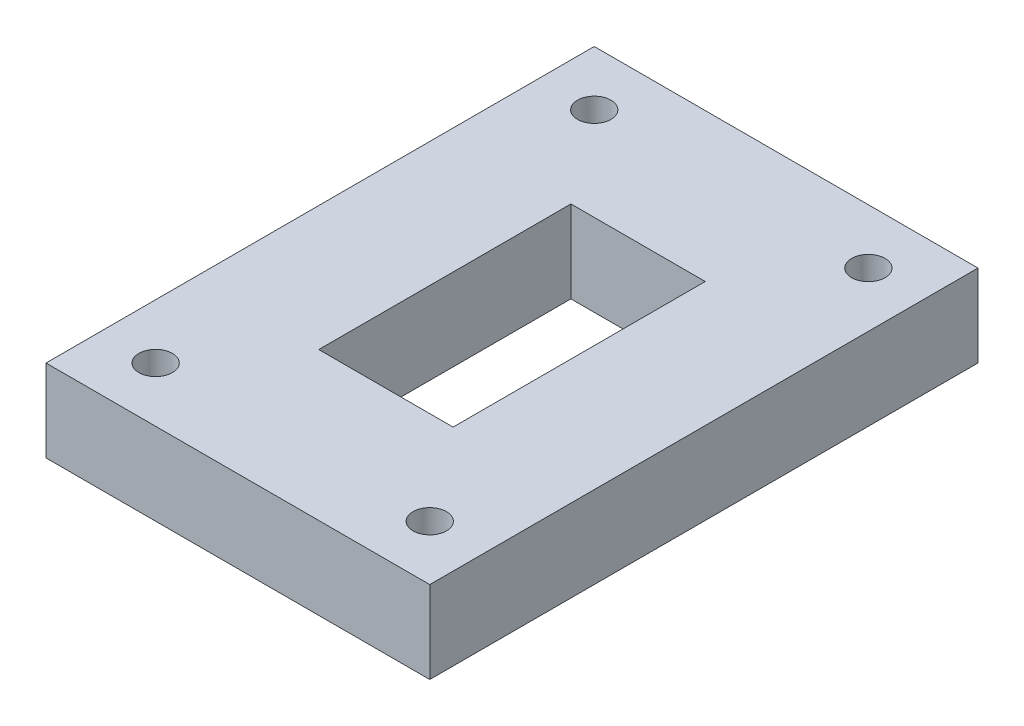
ISO-10303-21;
HEADER;
FILE_DESCRIPTION(('STEP AP214'),'2;1');
FILE_NAME('part.step','',(''),(''),'','','');
FILE_SCHEMA(('AUTOMOTIVE_DESIGN { 1 0 10303 214 1 1 1 1 }'));
ENDSEC;
DATA;
#1=APPLICATION_CONTEXT('core data for automotive mechanical design processes');
#2=APPLICATION_PROTOCOL_DEFINITION('international standard','automotive_design',2000,#1);
#3=PRODUCT_CONTEXT('',#1,'mechanical');
#4=PRODUCT('Part','Part','',(#3));
#5=PRODUCT_RELATED_PRODUCT_CATEGORY('part','',(#4));
#6=PRODUCT_DEFINITION_FORMATION('','',#4);
#7=PRODUCT_DEFINITION_CONTEXT('part definition',#1,'design');
#8=PRODUCT_DEFINITION('design','',#6,#7);
#9=PRODUCT_DEFINITION_SHAPE('','',#8);
#10=(LENGTH_UNIT() NAMED_UNIT(*) SI_UNIT(.MILLI.,.METRE.));
#11=(NAMED_UNIT(*) PLANE_ANGLE_UNIT() SI_UNIT($,.RADIAN.));
#12=(NAMED_UNIT(*) SI_UNIT($,.STERADIAN.) SOLID_ANGLE_UNIT());
#13=UNCERTAINTY_MEASURE_WITH_UNIT(LENGTH_MEASURE(1.E-05),#10,'distance_accuracy_value','');
#14=(GEOMETRIC_REPRESENTATION_CONTEXT(3) GLOBAL_UNCERTAINTY_ASSIGNED_CONTEXT((#13)) GLOBAL_UNIT_ASSIGNED_CONTEXT((#10,
#11,#12)) REPRESENTATION_CONTEXT('',''));
#15=CARTESIAN_POINT('',(0.,0.,0.));
#16=DIRECTION('',(0.,0.,1.));
#17=DIRECTION('',(1.,0.,0.));
#18=AXIS2_PLACEMENT_3D('',#15,#16,#17);
#19=CARTESIAN_POINT('',(0.,-7.5,0.));
#20=DIRECTION('',(-1.,0.,0.));
#21=DIRECTION('',(0.,0.,1.));
#22=AXIS2_PLACEMENT_3D('',#19,#20,#21);
#23=PLANE('',#22);
#24=DIRECTION('',(0.,0.,1.));
#25=VECTOR('',#24,1.);
#26=CARTESIAN_POINT('',(0.,0.,0.));
#27=LINE('',#26,#25);
#28=CARTESIAN_POINT('',(0.,0.,0.));
#29=VERTEX_POINT('',#28);
#30=CARTESIAN_POINT('',(0.,0.,50.));
#31=VERTEX_POINT('',#30);
#32=EDGE_CURVE('E137',#29,#31,#27,.T.);
#33=ORIENTED_EDGE('',*,*,#32,.F.);
#34=DIRECTION('',(0.,1.,0.));
#35=VECTOR('',#34,1.);
#36=CARTESIAN_POINT('',(0.,-7.5,0.));
#37=LINE('',#36,#35);
#38=CARTESIAN_POINT('',(0.,-7.5,0.));
#39=VERTEX_POINT('',#38);
#40=EDGE_CURVE('E11',#39,#29,#37,.T.);
#41=ORIENTED_EDGE('',*,*,#40,.F.);
#42=DIRECTION('',(0.,0.,1.));
#43=VECTOR('',#42,1.);
#44=CARTESIAN_POINT('',(0.,-7.5,0.));
#45=LINE('',#44,#43);
#46=CARTESIAN_POINT('',(0.,-7.5,50.));
#47=VERTEX_POINT('',#46);
#48=EDGE_CURVE('E141',#39,#47,#45,.T.);
#49=ORIENTED_EDGE('',*,*,#48,.T.);
#50=DIRECTION('',(0.,1.,0.));
#51=VECTOR('',#50,1.);
#52=CARTESIAN_POINT('',(0.,-7.5,50.));
#53=LINE('',#52,#51);
#54=EDGE_CURVE('E38',#47,#31,#53,.T.);
#55=ORIENTED_EDGE('',*,*,#54,.T.);
#56=EDGE_LOOP('',(#33,#41,#49,#55));
#57=FACE_BOUND('',#56,.T.);
#58=ADVANCED_FACE('F35',(#57),#23,.T.);
#59=CARTESIAN_POINT('',(0.,-7.5,0.));
#60=DIRECTION('',(0.,0.,-1.));
#61=DIRECTION('',(-1.,0.,0.));
#62=AXIS2_PLACEMENT_3D('',#59,#60,#61);
#63=PLANE('',#62);
#64=DIRECTION('',(-1.,0.,0.));
#65=VECTOR('',#64,1.);
#66=CARTESIAN_POINT('',(0.,0.,0.));
#67=LINE('',#66,#65);
#68=CARTESIAN_POINT('',(35.,0.,0.));
#69=VERTEX_POINT('',#68);
#70=EDGE_CURVE('E145',#69,#29,#67,.T.);
#71=ORIENTED_EDGE('',*,*,#70,.F.);
#72=DIRECTION('',(0.,1.,0.));
#73=VECTOR('',#72,1.);
#74=CARTESIAN_POINT('',(35.,-7.5,0.));
#75=LINE('',#74,#73);
#76=CARTESIAN_POINT('',(35.,-7.5,0.));
#77=VERTEX_POINT('',#76);
#78=EDGE_CURVE('E43',#77,#69,#75,.T.);
#79=ORIENTED_EDGE('',*,*,#78,.F.);
#80=DIRECTION('',(-1.,0.,0.));
#81=VECTOR('',#80,1.);
#82=CARTESIAN_POINT('',(0.,-7.5,0.));
#83=LINE('',#82,#81);
#84=EDGE_CURVE('E151',#77,#39,#83,.T.);
#85=ORIENTED_EDGE('',*,*,#84,.T.);
#86=ORIENTED_EDGE('',*,*,#40,.T.);
#87=EDGE_LOOP('',(#71,#79,#85,#86));
#88=FACE_BOUND('',#87,.T.);
#89=ADVANCED_FACE('F177',(#88),#63,.T.);
#90=CARTESIAN_POINT('',(35.,-7.5,0.));
#91=DIRECTION('',(1.,0.,0.));
#92=DIRECTION('',(0.,0.,-1.));
#93=AXIS2_PLACEMENT_3D('',#90,#91,#92);
#94=PLANE('',#93);
#95=DIRECTION('',(0.,0.,-1.));
#96=VECTOR('',#95,1.);
#97=CARTESIAN_POINT('',(35.,0.,0.));
#98=LINE('',#97,#96);
#99=CARTESIAN_POINT('',(35.,0.,50.));
#100=VERTEX_POINT('',#99);
#101=EDGE_CURVE('E159',#100,#69,#98,.T.);
#102=ORIENTED_EDGE('',*,*,#101,.F.);
#103=DIRECTION('',(0.,1.,0.));
#104=VECTOR('',#103,1.);
#105=CARTESIAN_POINT('',(35.,-7.5,50.));
#106=LINE('',#105,#104);
#107=CARTESIAN_POINT('',(35.,-7.5,50.));
#108=VERTEX_POINT('',#107);
#109=EDGE_CURVE('E164',#108,#100,#106,.T.);
#110=ORIENTED_EDGE('',*,*,#109,.F.);
#111=DIRECTION('',(0.,0.,-1.));
#112=VECTOR('',#111,1.);
#113=CARTESIAN_POINT('',(35.,-7.5,0.));
#114=LINE('',#113,#112);
#115=EDGE_CURVE('E148',#108,#77,#114,.T.);
#116=ORIENTED_EDGE('',*,*,#115,.T.);
#117=ORIENTED_EDGE('',*,*,#78,.T.);
#118=EDGE_LOOP('',(#102,#110,#116,#117));
#119=FACE_BOUND('',#118,.T.);
#120=ADVANCED_FACE('F181',(#119),#94,.T.);
#121=CARTESIAN_POINT('',(0.,-7.5,50.));
#122=DIRECTION('',(0.,0.,1.));
#123=DIRECTION('',(1.,0.,0.));
#124=AXIS2_PLACEMENT_3D('',#121,#122,#123);
#125=PLANE('',#124);
#126=DIRECTION('',(1.,0.,0.));
#127=VECTOR('',#126,1.);
#128=CARTESIAN_POINT('',(0.,0.,50.));
#129=LINE('',#128,#127);
#130=EDGE_CURVE('E156',#31,#100,#129,.T.);
#131=ORIENTED_EDGE('',*,*,#130,.F.);
#132=ORIENTED_EDGE('',*,*,#54,.F.);
#133=DIRECTION('',(1.,0.,0.));
#134=VECTOR('',#133,1.);
#135=CARTESIAN_POINT('',(0.,-7.5,50.));
#136=LINE('',#135,#134);
#137=EDGE_CURVE('E144',#47,#108,#136,.T.);
#138=ORIENTED_EDGE('',*,*,#137,.T.);
#139=ORIENTED_EDGE('',*,*,#109,.T.);
#140=EDGE_LOOP('',(#131,#132,#138,#139));
#141=FACE_BOUND('',#140,.T.);
#142=ADVANCED_FACE('F172',(#141),#125,.T.);
#143=CARTESIAN_POINT('',(0.,-7.5,0.));
#144=DIRECTION('',(0.,1.,0.));
#145=DIRECTION('',(0.,0.,1.));
#146=AXIS2_PLACEMENT_3D('',#143,#144,#145);
#147=PLANE('',#146);
#148=CARTESIAN_POINT('',(4.99999999999999,-7.5,45.));
#149=DIRECTION('',(0.,-1.,0.));
#150=DIRECTION('',(0.,0.,1.));
#151=AXIS2_PLACEMENT_3D('',#148,#149,#150);
#152=CIRCLE('',#151,1.525);
#153=CARTESIAN_POINT('',(4.99999999999999,-7.5,46.525));
#154=VERTEX_POINT('',#153);
#155=EDGE_CURVE('E309',#154,#154,#152,.T.);
#156=ORIENTED_EDGE('',*,*,#155,.F.);
#157=EDGE_LOOP('',(#156));
#158=FACE_BOUND('',#157,.T.);
#159=CARTESIAN_POINT('',(30.,-7.5,45.));
#160=DIRECTION('',(0.,-1.,0.));
#161=DIRECTION('',(0.,0.,-1.));
#162=AXIS2_PLACEMENT_3D('',#159,#160,#161);
#163=CIRCLE('',#162,1.525);
#164=CARTESIAN_POINT('',(30.,-7.5,43.475));
#165=VERTEX_POINT('',#164);
#166=EDGE_CURVE('E314',#165,#165,#163,.T.);
#167=ORIENTED_EDGE('',*,*,#166,.F.);
#168=EDGE_LOOP('',(#167));
#169=FACE_BOUND('',#168,.T.);
#170=CARTESIAN_POINT('',(30.,-7.5,5.));
#171=DIRECTION('',(0.,-1.,0.));
#172=DIRECTION('',(0.,0.,1.));
#173=AXIS2_PLACEMENT_3D('',#170,#171,#172);
#174=CIRCLE('',#173,1.52500000000001);
#175=CARTESIAN_POINT('',(30.,-7.5,6.525));
#176=VERTEX_POINT('',#175);
#177=EDGE_CURVE('E322',#176,#176,#174,.T.);
#178=ORIENTED_EDGE('',*,*,#177,.F.);
#179=EDGE_LOOP('',(#178));
#180=FACE_BOUND('',#179,.T.);
#181=CARTESIAN_POINT('',(5.,-7.5,5.));
#182=DIRECTION('',(0.,-1.,0.));
#183=DIRECTION('',(0.,0.,-1.));
#184=AXIS2_PLACEMENT_3D('',#181,#182,#183);
#185=CIRCLE('',#184,1.525);
#186=CARTESIAN_POINT('',(5.,-7.5,3.47499999999999));
#187=VERTEX_POINT('',#186);
#188=EDGE_CURVE('E124',#187,#187,#185,.T.);
#189=ORIENTED_EDGE('',*,*,#188,.F.);
#190=EDGE_LOOP('',(#189));
#191=FACE_BOUND('',#190,.T.);
#192=DIRECTION('',(1.,0.,0.));
#193=VECTOR('',#192,1.);
#194=CARTESIAN_POINT('',(11.375,-7.5,36.5));
#195=LINE('',#194,#193);
#196=CARTESIAN_POINT('',(11.375,-7.5,36.5));
#197=VERTEX_POINT('',#196);
#198=CARTESIAN_POINT('',(23.625,-7.5,36.5));
#199=VERTEX_POINT('',#198);
#200=EDGE_CURVE('E108',#197,#199,#195,.T.);
#201=ORIENTED_EDGE('',*,*,#200,.T.);
#202=DIRECTION('',(0.,0.,-1.));
#203=VECTOR('',#202,1.);
#204=CARTESIAN_POINT('',(23.625,-7.5,13.5));
#205=LINE('',#204,#203);
#206=CARTESIAN_POINT('',(23.625,-7.5,13.5));
#207=VERTEX_POINT('',#206);
#208=EDGE_CURVE('E102',#199,#207,#205,.T.);
#209=ORIENTED_EDGE('',*,*,#208,.T.);
#210=DIRECTION('',(-1.,0.,0.));
#211=VECTOR('',#210,1.);
#212=CARTESIAN_POINT('',(11.375,-7.5,13.5));
#213=LINE('',#212,#211);
#214=CARTESIAN_POINT('',(11.375,-7.5,13.5));
#215=VERTEX_POINT('',#214);
#216=EDGE_CURVE('E111',#207,#215,#213,.T.);
#217=ORIENTED_EDGE('',*,*,#216,.T.);
#218=DIRECTION('',(0.,0.,1.));
#219=VECTOR('',#218,1.);
#220=CARTESIAN_POINT('',(11.375,-7.5,13.5));
#221=LINE('',#220,#219);
#222=EDGE_CURVE('E51',#215,#197,#221,.T.);
#223=ORIENTED_EDGE('',*,*,#222,.T.);
#224=EDGE_LOOP('',(#201,#209,#217,#223));
#225=FACE_BOUND('',#224,.T.);
#226=ORIENTED_EDGE('',*,*,#48,.F.);
#227=ORIENTED_EDGE('',*,*,#84,.F.);
#228=ORIENTED_EDGE('',*,*,#115,.F.);
#229=ORIENTED_EDGE('',*,*,#137,.F.);
#230=EDGE_LOOP('',(#226,#227,#228,#229));
#231=FACE_BOUND('',#230,.T.);
#232=ADVANCED_FACE('F115',(#158,#169,#180,#191,#225,#231),#147,.F.);
#233=CARTESIAN_POINT('',(0.,0.,0.));
#234=DIRECTION('',(0.,1.,0.));
#235=DIRECTION('',(0.,0.,1.));
#236=AXIS2_PLACEMENT_3D('',#233,#234,#235);
#237=PLANE('',#236);
#238=CARTESIAN_POINT('',(4.99999999999999,0.,45.));
#239=DIRECTION('',(0.,-1.,0.));
#240=DIRECTION('',(0.,0.,1.));
#241=AXIS2_PLACEMENT_3D('',#238,#239,#240);
#242=CIRCLE('',#241,1.525);
#243=CARTESIAN_POINT('',(4.99999999999999,0.,46.525));
#244=VERTEX_POINT('',#243);
#245=EDGE_CURVE('E306',#244,#244,#242,.T.);
#246=ORIENTED_EDGE('',*,*,#245,.T.);
#247=EDGE_LOOP('',(#246));
#248=FACE_BOUND('',#247,.T.);
#249=CARTESIAN_POINT('',(30.,0.,45.));
#250=DIRECTION('',(0.,-1.,0.));
#251=DIRECTION('',(0.,0.,-1.));
#252=AXIS2_PLACEMENT_3D('',#249,#250,#251);
#253=CIRCLE('',#252,1.525);
#254=CARTESIAN_POINT('',(30.,0.,43.475));
#255=VERTEX_POINT('',#254);
#256=EDGE_CURVE('E310',#255,#255,#253,.T.);
#257=ORIENTED_EDGE('',*,*,#256,.T.);
#258=EDGE_LOOP('',(#257));
#259=FACE_BOUND('',#258,.T.);
#260=CARTESIAN_POINT('',(30.,0.,5.));
#261=DIRECTION('',(0.,-1.,0.));
#262=DIRECTION('',(0.,0.,1.));
#263=AXIS2_PLACEMENT_3D('',#260,#261,#262);
#264=CIRCLE('',#263,1.52500000000001);
#265=CARTESIAN_POINT('',(30.,0.,6.525));
#266=VERTEX_POINT('',#265);
#267=EDGE_CURVE('E319',#266,#266,#264,.T.);
#268=ORIENTED_EDGE('',*,*,#267,.T.);
#269=EDGE_LOOP('',(#268));
#270=FACE_BOUND('',#269,.T.);
#271=CARTESIAN_POINT('',(5.,0.,5.));
#272=DIRECTION('',(0.,-1.,0.));
#273=DIRECTION('',(0.,0.,-1.));
#274=AXIS2_PLACEMENT_3D('',#271,#272,#273);
#275=CIRCLE('',#274,1.525);
#276=CARTESIAN_POINT('',(5.,0.,3.47499999999999));
#277=VERTEX_POINT('',#276);
#278=EDGE_CURVE('E131',#277,#277,#275,.T.);
#279=ORIENTED_EDGE('',*,*,#278,.T.);
#280=EDGE_LOOP('',(#279));
#281=FACE_BOUND('',#280,.T.);
#282=DIRECTION('',(0.,0.,-1.));
#283=VECTOR('',#282,1.);
#284=CARTESIAN_POINT('',(23.625,0.,13.5));
#285=LINE('',#284,#283);
#286=CARTESIAN_POINT('',(23.625,0.,36.5));
#287=VERTEX_POINT('',#286);
#288=CARTESIAN_POINT('',(23.625,0.,13.5));
#289=VERTEX_POINT('',#288);
#290=EDGE_CURVE('E59',#287,#289,#285,.T.);
#291=ORIENTED_EDGE('',*,*,#290,.F.);
#292=DIRECTION('',(1.,0.,0.));
#293=VECTOR('',#292,1.);
#294=CARTESIAN_POINT('',(11.375,0.,36.5));
#295=LINE('',#294,#293);
#296=CARTESIAN_POINT('',(11.375,0.,36.5));
#297=VERTEX_POINT('',#296);
#298=EDGE_CURVE('E118',#297,#287,#295,.T.);
#299=ORIENTED_EDGE('',*,*,#298,.F.);
#300=DIRECTION('',(0.,0.,1.));
#301=VECTOR('',#300,1.);
#302=CARTESIAN_POINT('',(11.375,0.,13.5));
#303=LINE('',#302,#301);
#304=CARTESIAN_POINT('',(11.375,0.,13.5));
#305=VERTEX_POINT('',#304);
#306=EDGE_CURVE('E121',#305,#297,#303,.T.);
#307=ORIENTED_EDGE('',*,*,#306,.F.);
#308=DIRECTION('',(-1.,0.,0.));
#309=VECTOR('',#308,1.);
#310=CARTESIAN_POINT('',(11.375,0.,13.5));
#311=LINE('',#310,#309);
#312=EDGE_CURVE('E130',#289,#305,#311,.T.);
#313=ORIENTED_EDGE('',*,*,#312,.F.);
#314=EDGE_LOOP('',(#291,#299,#307,#313));
#315=FACE_BOUND('',#314,.T.);
#316=ORIENTED_EDGE('',*,*,#32,.T.);
#317=ORIENTED_EDGE('',*,*,#130,.T.);
#318=ORIENTED_EDGE('',*,*,#101,.T.);
#319=ORIENTED_EDGE('',*,*,#70,.T.);
#320=EDGE_LOOP('',(#316,#317,#318,#319));
#321=FACE_BOUND('',#320,.T.);
#322=ADVANCED_FACE('F174',(#248,#259,#270,#281,#315,#321),#237,.T.);
#323=CARTESIAN_POINT('',(23.625,-7.5,13.5));
#324=DIRECTION('',(1.,0.,0.));
#325=DIRECTION('',(0.,0.,-1.));
#326=AXIS2_PLACEMENT_3D('',#323,#324,#325);
#327=PLANE('',#326);
#328=ORIENTED_EDGE('',*,*,#290,.T.);
#329=DIRECTION('',(0.,1.,0.));
#330=VECTOR('',#329,1.);
#331=CARTESIAN_POINT('',(23.625,-7.5,13.5));
#332=LINE('',#331,#330);
#333=EDGE_CURVE('E98',#207,#289,#332,.T.);
#334=ORIENTED_EDGE('',*,*,#333,.F.);
#335=ORIENTED_EDGE('',*,*,#208,.F.);
#336=DIRECTION('',(0.,1.,0.));
#337=VECTOR('',#336,1.);
#338=CARTESIAN_POINT('',(23.625,-7.5,36.5));
#339=LINE('',#338,#337);
#340=EDGE_CURVE('E135',#199,#287,#339,.T.);
#341=ORIENTED_EDGE('',*,*,#340,.T.);
#342=EDGE_LOOP('',(#328,#334,#335,#341));
#343=FACE_BOUND('',#342,.T.);
#344=ADVANCED_FACE('F100',(#343),#327,.F.);
#345=CARTESIAN_POINT('',(11.375,-7.5,36.5));
#346=DIRECTION('',(0.,0.,1.));
#347=DIRECTION('',(1.,0.,0.));
#348=AXIS2_PLACEMENT_3D('',#345,#346,#347);
#349=PLANE('',#348);
#350=ORIENTED_EDGE('',*,*,#298,.T.);
#351=ORIENTED_EDGE('',*,*,#340,.F.);
#352=ORIENTED_EDGE('',*,*,#200,.F.);
#353=DIRECTION('',(0.,1.,0.));
#354=VECTOR('',#353,1.);
#355=CARTESIAN_POINT('',(11.375,-7.5,36.5));
#356=LINE('',#355,#354);
#357=EDGE_CURVE('E138',#197,#297,#356,.T.);
#358=ORIENTED_EDGE('',*,*,#357,.T.);
#359=EDGE_LOOP('',(#350,#351,#352,#358));
#360=FACE_BOUND('',#359,.T.);
#361=ADVANCED_FACE('F217',(#360),#349,.F.);
#362=CARTESIAN_POINT('',(11.375,-7.5,13.5));
#363=DIRECTION('',(-1.,0.,0.));
#364=DIRECTION('',(0.,0.,1.));
#365=AXIS2_PLACEMENT_3D('',#362,#363,#364);
#366=PLANE('',#365);
#367=ORIENTED_EDGE('',*,*,#306,.T.);
#368=ORIENTED_EDGE('',*,*,#357,.F.);
#369=ORIENTED_EDGE('',*,*,#222,.F.);
#370=DIRECTION('',(0.,1.,0.));
#371=VECTOR('',#370,1.);
#372=CARTESIAN_POINT('',(11.375,-7.5,13.5));
#373=LINE('',#372,#371);
#374=EDGE_CURVE('E107',#215,#305,#373,.T.);
#375=ORIENTED_EDGE('',*,*,#374,.T.);
#376=EDGE_LOOP('',(#367,#368,#369,#375));
#377=FACE_BOUND('',#376,.T.);
#378=ADVANCED_FACE('F228',(#377),#366,.F.);
#379=CARTESIAN_POINT('',(11.375,-7.5,13.5));
#380=DIRECTION('',(0.,0.,-1.));
#381=DIRECTION('',(-1.,0.,0.));
#382=AXIS2_PLACEMENT_3D('',#379,#380,#381);
#383=PLANE('',#382);
#384=ORIENTED_EDGE('',*,*,#312,.T.);
#385=ORIENTED_EDGE('',*,*,#374,.F.);
#386=ORIENTED_EDGE('',*,*,#216,.F.);
#387=ORIENTED_EDGE('',*,*,#333,.T.);
#388=EDGE_LOOP('',(#384,#385,#386,#387));
#389=FACE_BOUND('',#388,.T.);
#390=ADVANCED_FACE('F112',(#389),#383,.F.);
#391=CARTESIAN_POINT('',(5.,0.,5.));
#392=DIRECTION('',(0.,-1.,0.));
#393=DIRECTION('',(0.,0.,-1.));
#394=AXIS2_PLACEMENT_3D('',#391,#392,#393);
#395=CYLINDRICAL_SURFACE('',#394,1.525);
#396=ORIENTED_EDGE('',*,*,#278,.F.);
#397=EDGE_LOOP('',(#396));
#398=FACE_BOUND('',#397,.T.);
#399=ORIENTED_EDGE('',*,*,#188,.T.);
#400=EDGE_LOOP('',(#399));
#401=FACE_BOUND('',#400,.T.);
#402=ADVANCED_FACE('F246',(#398,#401),#395,.F.);
#403=CARTESIAN_POINT('',(30.,0.,5.));
#404=DIRECTION('',(0.,-1.,0.));
#405=DIRECTION('',(0.,0.,-1.));
#406=AXIS2_PLACEMENT_3D('',#403,#404,#405);
#407=CYLINDRICAL_SURFACE('',#406,1.52500000000001);
#408=ORIENTED_EDGE('',*,*,#267,.F.);
#409=EDGE_LOOP('',(#408));
#410=FACE_BOUND('',#409,.T.);
#411=ORIENTED_EDGE('',*,*,#177,.T.);
#412=EDGE_LOOP('',(#411));
#413=FACE_BOUND('',#412,.T.);
#414=ADVANCED_FACE('F269',(#410,#413),#407,.F.);
#415=CARTESIAN_POINT('',(30.,0.,45.));
#416=DIRECTION('',(0.,-1.,0.));
#417=DIRECTION('',(0.,0.,-1.));
#418=AXIS2_PLACEMENT_3D('',#415,#416,#417);
#419=CYLINDRICAL_SURFACE('',#418,1.525);
#420=ORIENTED_EDGE('',*,*,#256,.F.);
#421=EDGE_LOOP('',(#420));
#422=FACE_BOUND('',#421,.T.);
#423=ORIENTED_EDGE('',*,*,#166,.T.);
#424=EDGE_LOOP('',(#423));
#425=FACE_BOUND('',#424,.T.);
#426=ADVANCED_FACE('F279',(#422,#425),#419,.F.);
#427=CARTESIAN_POINT('',(4.99999999999999,0.,45.));
#428=DIRECTION('',(0.,-1.,0.));
#429=DIRECTION('',(0.,0.,-1.));
#430=AXIS2_PLACEMENT_3D('',#427,#428,#429);
#431=CYLINDRICAL_SURFACE('',#430,1.525);
#432=ORIENTED_EDGE('',*,*,#245,.F.);
#433=EDGE_LOOP('',(#432));
#434=FACE_BOUND('',#433,.T.);
#435=ORIENTED_EDGE('',*,*,#155,.T.);
#436=EDGE_LOOP('',(#435));
#437=FACE_BOUND('',#436,.T.);
#438=ADVANCED_FACE('F289',(#434,#437),#431,.F.);
#439=CLOSED_SHELL('',(#58,#89,#120,#142,#232,#322,#344,#361,#378,#390,#402,#414,#426,#438));
#440=MANIFOLD_SOLID_BREP('B2',#439);
#441=ADVANCED_BREP_SHAPE_REPRESENTATION('',(#18,#440),#14);
#442=SHAPE_DEFINITION_REPRESENTATION(#9,#441);
ENDSEC;
END-ISO-10303-21;
